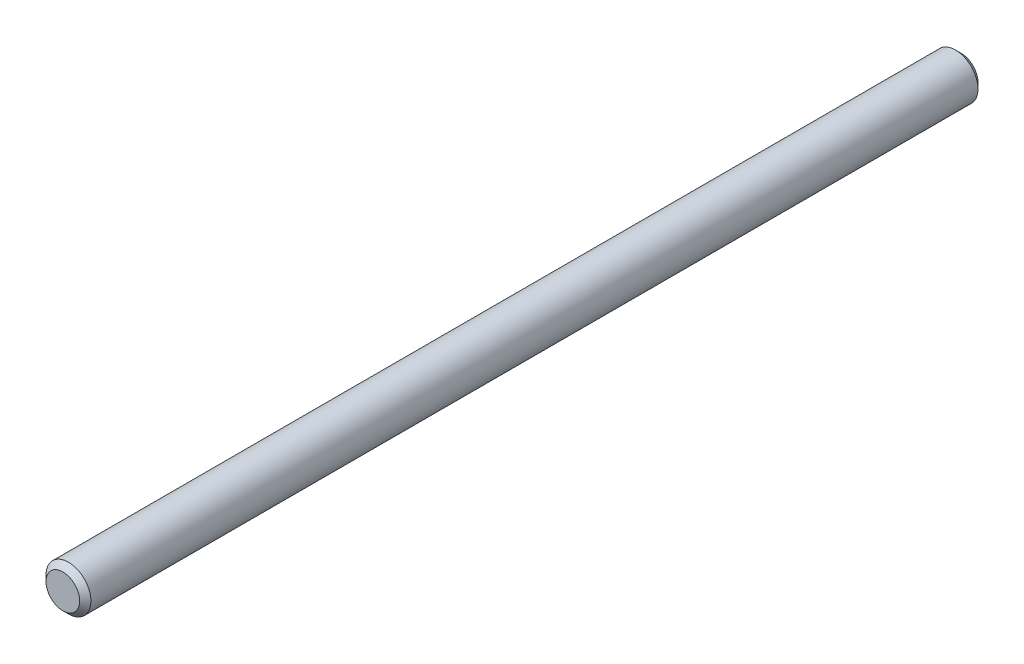
ISO-10303-21;
HEADER;
FILE_DESCRIPTION(('STEP AP214'),'2;1');
FILE_NAME('part.step','',(''),(''),'','','');
FILE_SCHEMA(('AUTOMOTIVE_DESIGN { 1 0 10303 214 1 1 1 1 }'));
ENDSEC;
DATA;
#1=APPLICATION_CONTEXT('core data for automotive mechanical design processes');
#2=APPLICATION_PROTOCOL_DEFINITION('international standard','automotive_design',2000,#1);
#3=PRODUCT_CONTEXT('',#1,'mechanical');
#4=PRODUCT('Part','Part','',(#3));
#5=PRODUCT_RELATED_PRODUCT_CATEGORY('part','',(#4));
#6=PRODUCT_DEFINITION_FORMATION('','',#4);
#7=PRODUCT_DEFINITION_CONTEXT('part definition',#1,'design');
#8=PRODUCT_DEFINITION('design','',#6,#7);
#9=PRODUCT_DEFINITION_SHAPE('','',#8);
#10=(LENGTH_UNIT() NAMED_UNIT(*) SI_UNIT(.MILLI.,.METRE.));
#11=(NAMED_UNIT(*) PLANE_ANGLE_UNIT() SI_UNIT($,.RADIAN.));
#12=(NAMED_UNIT(*) SI_UNIT($,.STERADIAN.) SOLID_ANGLE_UNIT());
#13=UNCERTAINTY_MEASURE_WITH_UNIT(LENGTH_MEASURE(1.E-05),#10,'distance_accuracy_value','');
#14=(GEOMETRIC_REPRESENTATION_CONTEXT(3) GLOBAL_UNCERTAINTY_ASSIGNED_CONTEXT((#13)) GLOBAL_UNIT_ASSIGNED_CONTEXT((#10,
#11,#12)) REPRESENTATION_CONTEXT('',''));
#15=CARTESIAN_POINT('',(0.,0.,0.));
#16=DIRECTION('',(0.,0.,1.));
#17=DIRECTION('',(1.,0.,0.));
#18=AXIS2_PLACEMENT_3D('',#15,#16,#17);
#19=CARTESIAN_POINT('',(0.,0.,80.));
#20=DIRECTION('',(0.,0.,1.));
#21=DIRECTION('',(1.,0.,0.));
#22=AXIS2_PLACEMENT_3D('',#19,#20,#21);
#23=PLANE('',#22);
#24=CARTESIAN_POINT('',(0.,0.,79.9999999999272));
#25=DIRECTION('',(0.,0.,-1.));
#26=DIRECTION('',(-1.,0.,0.));
#27=AXIS2_PLACEMENT_3D('',#24,#25,#26);
#28=CIRCLE('',#27,1.50000000002137);
#29=CARTESIAN_POINT('',(-1.50000000002137,0.,79.9999999999272));
#30=VERTEX_POINT('',#29);
#31=EDGE_CURVE('E18',#30,#30,#28,.T.);
#32=ORIENTED_EDGE('',*,*,#31,.F.);
#33=EDGE_LOOP('',(#32));
#34=FACE_BOUND('',#33,.T.);
#35=ADVANCED_FACE('F15',(#34),#23,.T.);
#36=CARTESIAN_POINT('',(0.,0.,0.));
#37=DIRECTION('',(0.,0.,1.));
#38=DIRECTION('',(1.,0.,0.));
#39=AXIS2_PLACEMENT_3D('',#36,#37,#38);
#40=PLANE('',#39);
#41=CARTESIAN_POINT('',(0.,0.,-5.6843418860808E-11));
#42=DIRECTION('',(0.,0.,1.));
#43=DIRECTION('',(1.,0.,0.));
#44=AXIS2_PLACEMENT_3D('',#41,#42,#43);
#45=CIRCLE('',#44,1.49999999996453);
#46=CARTESIAN_POINT('',(1.49999999996453,0.,-5.6843418860808E-11));
#47=VERTEX_POINT('',#46);
#48=EDGE_CURVE('E27',#47,#47,#45,.T.);
#49=ORIENTED_EDGE('',*,*,#48,.F.);
#50=EDGE_LOOP('',(#49));
#51=FACE_BOUND('',#50,.T.);
#52=ADVANCED_FACE('F38',(#51),#40,.F.);
#53=CARTESIAN_POINT('',(0.,0.,79.5000000001096));
#54=DIRECTION('',(0.,0.,-1.));
#55=DIRECTION('',(-1.,0.,0.));
#56=AXIS2_PLACEMENT_3D('',#53,#54,#55);
#57=CONICAL_SURFACE('',#56,1.99999999983902,0.785398163397448);
#58=CARTESIAN_POINT('',(0.,0.,79.5));
#59=DIRECTION('',(0.,0.,-1.));
#60=DIRECTION('',(-1.,0.,0.));
#61=AXIS2_PLACEMENT_3D('',#58,#59,#60);
#62=CIRCLE('',#61,2.);
#63=CARTESIAN_POINT('',(-2.,0.,79.5));
#64=VERTEX_POINT('',#63);
#65=EDGE_CURVE('E22',#64,#64,#62,.T.);
#66=ORIENTED_EDGE('',*,*,#65,.F.);
#67=EDGE_LOOP('',(#66));
#68=FACE_BOUND('',#67,.T.);
#69=ORIENTED_EDGE('',*,*,#31,.T.);
#70=EDGE_LOOP('',(#69));
#71=FACE_BOUND('',#70,.T.);
#72=ADVANCED_FACE('F35',(#68,#71),#57,.T.);
#73=CARTESIAN_POINT('',(0.,0.,0.49999999987449));
#74=DIRECTION('',(0.,0.,1.));
#75=DIRECTION('',(1.,0.,0.));
#76=AXIS2_PLACEMENT_3D('',#73,#74,#75);
#77=CONICAL_SURFACE('',#76,1.99999999989586,0.785398163397448);
#78=CARTESIAN_POINT('',(0.,0.,0.499999999999987));
#79=DIRECTION('',(0.,0.,-1.));
#80=DIRECTION('',(-1.,0.,0.));
#81=AXIS2_PLACEMENT_3D('',#78,#79,#80);
#82=CIRCLE('',#81,2.);
#83=CARTESIAN_POINT('',(-2.,0.,0.499999999999987));
#84=VERTEX_POINT('',#83);
#85=EDGE_CURVE('E9',#84,#84,#82,.F.);
#86=ORIENTED_EDGE('',*,*,#85,.F.);
#87=EDGE_LOOP('',(#86));
#88=FACE_BOUND('',#87,.T.);
#89=ORIENTED_EDGE('',*,*,#48,.T.);
#90=EDGE_LOOP('',(#89));
#91=FACE_BOUND('',#90,.T.);
#92=ADVANCED_FACE('F45',(#88,#91),#77,.T.);
#93=CARTESIAN_POINT('',(0.,0.,80.));
#94=DIRECTION('',(0.,0.,-1.));
#95=DIRECTION('',(-1.,0.,0.));
#96=AXIS2_PLACEMENT_3D('',#93,#94,#95);
#97=CYLINDRICAL_SURFACE('',#96,2.);
#98=ORIENTED_EDGE('',*,*,#85,.T.);
#99=EDGE_LOOP('',(#98));
#100=FACE_BOUND('',#99,.T.);
#101=ORIENTED_EDGE('',*,*,#65,.T.);
#102=EDGE_LOOP('',(#101));
#103=FACE_BOUND('',#102,.T.);
#104=ADVANCED_FACE('F43',(#100,#103),#97,.T.);
#105=CLOSED_SHELL('',(#35,#52,#72,#92,#104));
#106=MANIFOLD_SOLID_BREP('B1',#105);
#107=ADVANCED_BREP_SHAPE_REPRESENTATION('',(#18,#106),#14);
#108=SHAPE_DEFINITION_REPRESENTATION(#9,#107);
ENDSEC;
END-ISO-10303-21;
